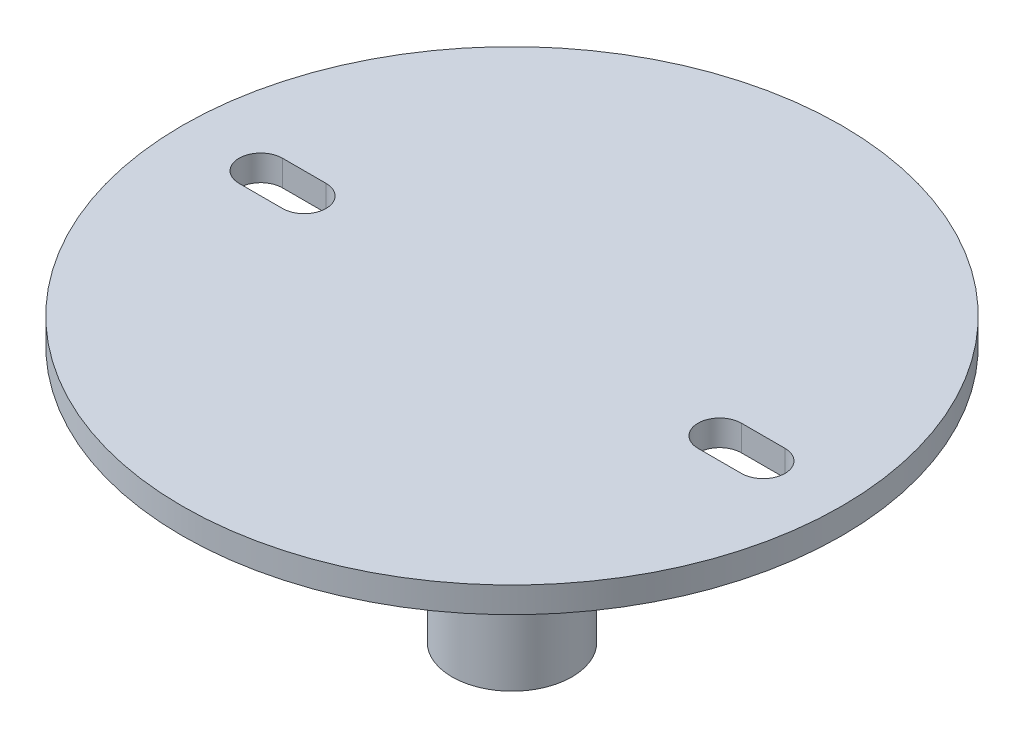
ISO-10303-21;
HEADER;
FILE_DESCRIPTION(('STEP AP214'),'2;1');
FILE_NAME('part.step','',(''),(''),'','','');
FILE_SCHEMA(('AUTOMOTIVE_DESIGN { 1 0 10303 214 1 1 1 1 }'));
ENDSEC;
DATA;
#1=APPLICATION_CONTEXT('core data for automotive mechanical design processes');
#2=APPLICATION_PROTOCOL_DEFINITION('international standard','automotive_design',2000,#1);
#3=PRODUCT_CONTEXT('',#1,'mechanical');
#4=PRODUCT('Part','Part','',(#3));
#5=PRODUCT_RELATED_PRODUCT_CATEGORY('part','',(#4));
#6=PRODUCT_DEFINITION_FORMATION('','',#4);
#7=PRODUCT_DEFINITION_CONTEXT('part definition',#1,'design');
#8=PRODUCT_DEFINITION('design','',#6,#7);
#9=PRODUCT_DEFINITION_SHAPE('','',#8);
#10=(LENGTH_UNIT() NAMED_UNIT(*) SI_UNIT(.MILLI.,.METRE.));
#11=(NAMED_UNIT(*) PLANE_ANGLE_UNIT() SI_UNIT($,.RADIAN.));
#12=(NAMED_UNIT(*) SI_UNIT($,.STERADIAN.) SOLID_ANGLE_UNIT());
#13=UNCERTAINTY_MEASURE_WITH_UNIT(LENGTH_MEASURE(1.E-05),#10,'distance_accuracy_value','');
#14=(GEOMETRIC_REPRESENTATION_CONTEXT(3) GLOBAL_UNCERTAINTY_ASSIGNED_CONTEXT((#13)) GLOBAL_UNIT_ASSIGNED_CONTEXT((#10,
#11,#12)) REPRESENTATION_CONTEXT('',''));
#15=CARTESIAN_POINT('',(0.,0.,0.));
#16=DIRECTION('',(0.,0.,1.));
#17=DIRECTION('',(1.,0.,0.));
#18=AXIS2_PLACEMENT_3D('',#15,#16,#17);
#19=CARTESIAN_POINT('',(0.,1.5,0.));
#20=DIRECTION('',(0.,1.,0.));
#21=DIRECTION('',(0.,0.,1.));
#22=AXIS2_PLACEMENT_3D('',#19,#20,#21);
#23=PLANE('',#22);
#24=CARTESIAN_POINT('',(0.,1.5,0.));
#25=DIRECTION('',(0.,1.,0.));
#26=DIRECTION('',(0.,0.,1.));
#27=AXIS2_PLACEMENT_3D('',#24,#25,#26);
#28=CIRCLE('',#27,19.24);
#29=CARTESIAN_POINT('',(0.,1.5,19.24));
#30=VERTEX_POINT('',#29);
#31=EDGE_CURVE('E166',#30,#30,#28,.T.);
#32=ORIENTED_EDGE('',*,*,#31,.T.);
#33=EDGE_LOOP('',(#32));
#34=FACE_BOUND('',#33,.T.);
#35=DIRECTION('',(-1.,0.,0.));
#36=VECTOR('',#35,1.);
#37=CARTESIAN_POINT('',(14.66,1.5,-1.27));
#38=LINE('',#37,#36);
#39=CARTESIAN_POINT('',(14.66,1.5,-1.27));
#40=VERTEX_POINT('',#39);
#41=CARTESIAN_POINT('',(12.12,1.5,-1.27));
#42=VERTEX_POINT('',#41);
#43=EDGE_CURVE('E137',#40,#42,#38,.T.);
#44=ORIENTED_EDGE('',*,*,#43,.F.);
#45=CARTESIAN_POINT('',(14.66,1.5,0.));
#46=DIRECTION('',(0.,1.,0.));
#47=DIRECTION('',(0.,0.,-1.));
#48=AXIS2_PLACEMENT_3D('',#45,#46,#47);
#49=CIRCLE('',#48,1.27);
#50=CARTESIAN_POINT('',(14.66,1.5,1.27));
#51=VERTEX_POINT('',#50);
#52=EDGE_CURVE('E135',#51,#40,#49,.T.);
#53=ORIENTED_EDGE('',*,*,#52,.F.);
#54=DIRECTION('',(1.,0.,0.));
#55=VECTOR('',#54,1.);
#56=CARTESIAN_POINT('',(14.66,1.5,1.27));
#57=LINE('',#56,#55);
#58=CARTESIAN_POINT('',(12.12,1.5,1.27));
#59=VERTEX_POINT('',#58);
#60=EDGE_CURVE('E143',#59,#51,#57,.T.);
#61=ORIENTED_EDGE('',*,*,#60,.F.);
#62=CARTESIAN_POINT('',(12.12,1.5,0.));
#63=DIRECTION('',(0.,1.,0.));
#64=DIRECTION('',(0.,0.,1.));
#65=AXIS2_PLACEMENT_3D('',#62,#63,#64);
#66=CIRCLE('',#65,1.27);
#67=EDGE_CURVE('E140',#42,#59,#66,.T.);
#68=ORIENTED_EDGE('',*,*,#67,.F.);
#69=EDGE_LOOP('',(#44,#53,#61,#68));
#70=FACE_BOUND('',#69,.T.);
#71=DIRECTION('',(1.,0.,0.));
#72=VECTOR('',#71,1.);
#73=CARTESIAN_POINT('',(-14.66,1.5,1.27));
#74=LINE('',#73,#72);
#75=CARTESIAN_POINT('',(-14.66,1.5,1.27));
#76=VERTEX_POINT('',#75);
#77=CARTESIAN_POINT('',(-12.12,1.5,1.27));
#78=VERTEX_POINT('',#77);
#79=EDGE_CURVE('E105',#76,#78,#74,.T.);
#80=ORIENTED_EDGE('',*,*,#79,.F.);
#81=CARTESIAN_POINT('',(-14.66,1.5,0.));
#82=DIRECTION('',(0.,1.,0.));
#83=DIRECTION('',(0.,0.,1.));
#84=AXIS2_PLACEMENT_3D('',#81,#82,#83);
#85=CIRCLE('',#84,1.27);
#86=CARTESIAN_POINT('',(-14.66,1.5,-1.27));
#87=VERTEX_POINT('',#86);
#88=EDGE_CURVE('E97',#87,#76,#85,.T.);
#89=ORIENTED_EDGE('',*,*,#88,.F.);
#90=DIRECTION('',(-1.,0.,0.));
#91=VECTOR('',#90,1.);
#92=CARTESIAN_POINT('',(-14.66,1.5,-1.27));
#93=LINE('',#92,#91);
#94=CARTESIAN_POINT('',(-12.12,1.5,-1.27));
#95=VERTEX_POINT('',#94);
#96=EDGE_CURVE('E119',#95,#87,#93,.T.);
#97=ORIENTED_EDGE('',*,*,#96,.F.);
#98=CARTESIAN_POINT('',(-12.12,1.5,0.));
#99=DIRECTION('',(0.,1.,0.));
#100=DIRECTION('',(0.,0.,-1.));
#101=AXIS2_PLACEMENT_3D('',#98,#99,#100);
#102=CIRCLE('',#101,1.27);
#103=EDGE_CURVE('E117',#78,#95,#102,.T.);
#104=ORIENTED_EDGE('',*,*,#103,.F.);
#105=EDGE_LOOP('',(#80,#89,#97,#104));
#106=FACE_BOUND('',#105,.T.);
#107=ADVANCED_FACE('F32',(#34,#70,#106),#23,.T.);
#108=CARTESIAN_POINT('',(0.,0.,0.));
#109=DIRECTION('',(0.,1.,0.));
#110=DIRECTION('',(0.,0.,1.));
#111=AXIS2_PLACEMENT_3D('',#108,#109,#110);
#112=PLANE('',#111);
#113=CARTESIAN_POINT('',(0.,0.,0.));
#114=DIRECTION('',(0.,1.,0.));
#115=DIRECTION('',(0.,0.,1.));
#116=AXIS2_PLACEMENT_3D('',#113,#114,#115);
#117=CIRCLE('',#116,4.5);
#118=CARTESIAN_POINT('',(0.,0.,4.5));
#119=VERTEX_POINT('',#118);
#120=EDGE_CURVE('E11',#119,#119,#117,.T.);
#121=ORIENTED_EDGE('',*,*,#120,.T.);
#122=EDGE_LOOP('',(#121));
#123=FACE_BOUND('',#122,.T.);
#124=CARTESIAN_POINT('',(14.66,0.,0.));
#125=DIRECTION('',(0.,1.,0.));
#126=DIRECTION('',(0.,0.,-1.));
#127=AXIS2_PLACEMENT_3D('',#124,#125,#126);
#128=CIRCLE('',#127,1.27);
#129=CARTESIAN_POINT('',(14.66,0.,1.27));
#130=VERTEX_POINT('',#129);
#131=CARTESIAN_POINT('',(14.66,0.,-1.27));
#132=VERTEX_POINT('',#131);
#133=EDGE_CURVE('E113',#130,#132,#128,.T.);
#134=ORIENTED_EDGE('',*,*,#133,.T.);
#135=DIRECTION('',(-1.,0.,0.));
#136=VECTOR('',#135,1.);
#137=CARTESIAN_POINT('',(14.66,0.,-1.27));
#138=LINE('',#137,#136);
#139=CARTESIAN_POINT('',(12.12,0.,-1.27));
#140=VERTEX_POINT('',#139);
#141=EDGE_CURVE('E148',#132,#140,#138,.T.);
#142=ORIENTED_EDGE('',*,*,#141,.T.);
#143=CARTESIAN_POINT('',(12.12,0.,0.));
#144=DIRECTION('',(0.,1.,0.));
#145=DIRECTION('',(0.,0.,1.));
#146=AXIS2_PLACEMENT_3D('',#143,#144,#145);
#147=CIRCLE('',#146,1.27);
#148=CARTESIAN_POINT('',(12.12,0.,1.27));
#149=VERTEX_POINT('',#148);
#150=EDGE_CURVE('E151',#140,#149,#147,.T.);
#151=ORIENTED_EDGE('',*,*,#150,.T.);
#152=DIRECTION('',(1.,0.,0.));
#153=VECTOR('',#152,1.);
#154=CARTESIAN_POINT('',(14.66,0.,1.27));
#155=LINE('',#154,#153);
#156=EDGE_CURVE('E138',#149,#130,#155,.T.);
#157=ORIENTED_EDGE('',*,*,#156,.T.);
#158=EDGE_LOOP('',(#134,#142,#151,#157));
#159=FACE_BOUND('',#158,.T.);
#160=CARTESIAN_POINT('',(0.,0.,0.));
#161=DIRECTION('',(0.,1.,0.));
#162=DIRECTION('',(0.,0.,1.));
#163=AXIS2_PLACEMENT_3D('',#160,#161,#162);
#164=CIRCLE('',#163,19.24);
#165=CARTESIAN_POINT('',(0.,0.,19.24));
#166=VERTEX_POINT('',#165);
#167=EDGE_CURVE('E165',#166,#166,#164,.T.);
#168=ORIENTED_EDGE('',*,*,#167,.F.);
#169=EDGE_LOOP('',(#168));
#170=FACE_BOUND('',#169,.T.);
#171=CARTESIAN_POINT('',(-14.66,0.,0.));
#172=DIRECTION('',(0.,1.,0.));
#173=DIRECTION('',(0.,0.,1.));
#174=AXIS2_PLACEMENT_3D('',#171,#172,#173);
#175=CIRCLE('',#174,1.27);
#176=CARTESIAN_POINT('',(-14.66,0.,-1.27));
#177=VERTEX_POINT('',#176);
#178=CARTESIAN_POINT('',(-14.66,0.,1.27));
#179=VERTEX_POINT('',#178);
#180=EDGE_CURVE('E55',#177,#179,#175,.T.);
#181=ORIENTED_EDGE('',*,*,#180,.T.);
#182=DIRECTION('',(1.,0.,0.));
#183=VECTOR('',#182,1.);
#184=CARTESIAN_POINT('',(-14.66,0.,1.27));
#185=LINE('',#184,#183);
#186=CARTESIAN_POINT('',(-12.12,0.,1.27));
#187=VERTEX_POINT('',#186);
#188=EDGE_CURVE('E112',#179,#187,#185,.T.);
#189=ORIENTED_EDGE('',*,*,#188,.T.);
#190=CARTESIAN_POINT('',(-12.12,0.,0.));
#191=DIRECTION('',(0.,1.,0.));
#192=DIRECTION('',(0.,0.,-1.));
#193=AXIS2_PLACEMENT_3D('',#190,#191,#192);
#194=CIRCLE('',#193,1.27);
#195=CARTESIAN_POINT('',(-12.12,0.,-1.27));
#196=VERTEX_POINT('',#195);
#197=EDGE_CURVE('E127',#187,#196,#194,.T.);
#198=ORIENTED_EDGE('',*,*,#197,.T.);
#199=DIRECTION('',(-1.,0.,0.));
#200=VECTOR('',#199,1.);
#201=CARTESIAN_POINT('',(-14.66,0.,-1.27));
#202=LINE('',#201,#200);
#203=EDGE_CURVE('E106',#196,#177,#202,.T.);
#204=ORIENTED_EDGE('',*,*,#203,.T.);
#205=EDGE_LOOP('',(#181,#189,#198,#204));
#206=FACE_BOUND('',#205,.T.);
#207=ADVANCED_FACE('F185',(#123,#159,#170,#206),#112,.F.);
#208=CARTESIAN_POINT('',(0.,1.5,0.));
#209=DIRECTION('',(0.,-1.,0.));
#210=DIRECTION('',(0.,0.,-1.));
#211=AXIS2_PLACEMENT_3D('',#208,#209,#210);
#212=CYLINDRICAL_SURFACE('',#211,19.24);
#213=ORIENTED_EDGE('',*,*,#31,.F.);
#214=EDGE_LOOP('',(#213));
#215=FACE_BOUND('',#214,.T.);
#216=ORIENTED_EDGE('',*,*,#167,.T.);
#217=EDGE_LOOP('',(#216));
#218=FACE_BOUND('',#217,.T.);
#219=ADVANCED_FACE('F193',(#215,#218),#212,.T.);
#220=CARTESIAN_POINT('',(14.66,1.5,0.));
#221=DIRECTION('',(0.,-1.,0.));
#222=DIRECTION('',(0.,0.,-1.));
#223=AXIS2_PLACEMENT_3D('',#220,#221,#222);
#224=CYLINDRICAL_SURFACE('',#223,1.27);
#225=ORIENTED_EDGE('',*,*,#133,.F.);
#226=DIRECTION('',(0.,-1.,0.));
#227=VECTOR('',#226,1.);
#228=CARTESIAN_POINT('',(14.66,1.5,1.27));
#229=LINE('',#228,#227);
#230=EDGE_CURVE('E145',#51,#130,#229,.T.);
#231=ORIENTED_EDGE('',*,*,#230,.F.);
#232=ORIENTED_EDGE('',*,*,#52,.T.);
#233=DIRECTION('',(0.,-1.,0.));
#234=VECTOR('',#233,1.);
#235=CARTESIAN_POINT('',(14.66,1.5,-1.27));
#236=LINE('',#235,#234);
#237=EDGE_CURVE('E162',#40,#132,#236,.T.);
#238=ORIENTED_EDGE('',*,*,#237,.T.);
#239=EDGE_LOOP('',(#225,#231,#232,#238));
#240=FACE_BOUND('',#239,.T.);
#241=ADVANCED_FACE('F197',(#240),#224,.F.);
#242=CARTESIAN_POINT('',(14.66,1.5,-1.27));
#243=DIRECTION('',(0.,0.,1.));
#244=DIRECTION('',(1.,0.,0.));
#245=AXIS2_PLACEMENT_3D('',#242,#243,#244);
#246=PLANE('',#245);
#247=ORIENTED_EDGE('',*,*,#141,.F.);
#248=ORIENTED_EDGE('',*,*,#237,.F.);
#249=ORIENTED_EDGE('',*,*,#43,.T.);
#250=DIRECTION('',(0.,-1.,0.));
#251=VECTOR('',#250,1.);
#252=CARTESIAN_POINT('',(12.12,1.5,-1.27));
#253=LINE('',#252,#251);
#254=EDGE_CURVE('E160',#42,#140,#253,.T.);
#255=ORIENTED_EDGE('',*,*,#254,.T.);
#256=EDGE_LOOP('',(#247,#248,#249,#255));
#257=FACE_BOUND('',#256,.T.);
#258=ADVANCED_FACE('F204',(#257),#246,.T.);
#259=CARTESIAN_POINT('',(12.12,1.5,0.));
#260=DIRECTION('',(0.,-1.,0.));
#261=DIRECTION('',(0.,0.,-1.));
#262=AXIS2_PLACEMENT_3D('',#259,#260,#261);
#263=CYLINDRICAL_SURFACE('',#262,1.27);
#264=ORIENTED_EDGE('',*,*,#150,.F.);
#265=ORIENTED_EDGE('',*,*,#254,.F.);
#266=ORIENTED_EDGE('',*,*,#67,.T.);
#267=DIRECTION('',(0.,-1.,0.));
#268=VECTOR('',#267,1.);
#269=CARTESIAN_POINT('',(12.12,1.5,1.27));
#270=LINE('',#269,#268);
#271=EDGE_CURVE('E158',#59,#149,#270,.T.);
#272=ORIENTED_EDGE('',*,*,#271,.T.);
#273=EDGE_LOOP('',(#264,#265,#266,#272));
#274=FACE_BOUND('',#273,.T.);
#275=ADVANCED_FACE('F234',(#274),#263,.F.);
#276=CARTESIAN_POINT('',(14.66,1.5,1.27));
#277=DIRECTION('',(0.,0.,-1.));
#278=DIRECTION('',(-1.,0.,0.));
#279=AXIS2_PLACEMENT_3D('',#276,#277,#278);
#280=PLANE('',#279);
#281=ORIENTED_EDGE('',*,*,#156,.F.);
#282=ORIENTED_EDGE('',*,*,#271,.F.);
#283=ORIENTED_EDGE('',*,*,#60,.T.);
#284=ORIENTED_EDGE('',*,*,#230,.T.);
#285=EDGE_LOOP('',(#281,#282,#283,#284));
#286=FACE_BOUND('',#285,.T.);
#287=ADVANCED_FACE('F231',(#286),#280,.T.);
#288=CARTESIAN_POINT('',(-14.66,1.5,0.));
#289=DIRECTION('',(0.,-1.,0.));
#290=DIRECTION('',(0.,0.,-1.));
#291=AXIS2_PLACEMENT_3D('',#288,#289,#290);
#292=CYLINDRICAL_SURFACE('',#291,1.27);
#293=ORIENTED_EDGE('',*,*,#180,.F.);
#294=DIRECTION('',(0.,-1.,0.));
#295=VECTOR('',#294,1.);
#296=CARTESIAN_POINT('',(-14.66,1.5,-1.27));
#297=LINE('',#296,#295);
#298=EDGE_CURVE('E101',#87,#177,#297,.T.);
#299=ORIENTED_EDGE('',*,*,#298,.F.);
#300=ORIENTED_EDGE('',*,*,#88,.T.);
#301=DIRECTION('',(0.,-1.,0.));
#302=VECTOR('',#301,1.);
#303=CARTESIAN_POINT('',(-14.66,1.5,1.27));
#304=LINE('',#303,#302);
#305=EDGE_CURVE('E100',#76,#179,#304,.T.);
#306=ORIENTED_EDGE('',*,*,#305,.T.);
#307=EDGE_LOOP('',(#293,#299,#300,#306));
#308=FACE_BOUND('',#307,.T.);
#309=ADVANCED_FACE('F99',(#308),#292,.F.);
#310=CARTESIAN_POINT('',(-14.66,1.5,1.27));
#311=DIRECTION('',(0.,0.,-1.));
#312=DIRECTION('',(-1.,0.,0.));
#313=AXIS2_PLACEMENT_3D('',#310,#311,#312);
#314=PLANE('',#313);
#315=ORIENTED_EDGE('',*,*,#188,.F.);
#316=ORIENTED_EDGE('',*,*,#305,.F.);
#317=ORIENTED_EDGE('',*,*,#79,.T.);
#318=DIRECTION('',(0.,-1.,0.));
#319=VECTOR('',#318,1.);
#320=CARTESIAN_POINT('',(-12.12,1.5,1.27));
#321=LINE('',#320,#319);
#322=EDGE_CURVE('E114',#78,#187,#321,.T.);
#323=ORIENTED_EDGE('',*,*,#322,.T.);
#324=EDGE_LOOP('',(#315,#316,#317,#323));
#325=FACE_BOUND('',#324,.T.);
#326=ADVANCED_FACE('F109',(#325),#314,.T.);
#327=CARTESIAN_POINT('',(-12.12,1.5,0.));
#328=DIRECTION('',(0.,-1.,0.));
#329=DIRECTION('',(0.,0.,-1.));
#330=AXIS2_PLACEMENT_3D('',#327,#328,#329);
#331=CYLINDRICAL_SURFACE('',#330,1.27);
#332=ORIENTED_EDGE('',*,*,#197,.F.);
#333=ORIENTED_EDGE('',*,*,#322,.F.);
#334=ORIENTED_EDGE('',*,*,#103,.T.);
#335=DIRECTION('',(0.,-1.,0.));
#336=VECTOR('',#335,1.);
#337=CARTESIAN_POINT('',(-12.12,1.5,-1.27));
#338=LINE('',#337,#336);
#339=EDGE_CURVE('E47',#95,#196,#338,.T.);
#340=ORIENTED_EDGE('',*,*,#339,.T.);
#341=EDGE_LOOP('',(#332,#333,#334,#340));
#342=FACE_BOUND('',#341,.T.);
#343=ADVANCED_FACE('F215',(#342),#331,.F.);
#344=CARTESIAN_POINT('',(-14.66,1.5,-1.27));
#345=DIRECTION('',(0.,0.,1.));
#346=DIRECTION('',(1.,0.,0.));
#347=AXIS2_PLACEMENT_3D('',#344,#345,#346);
#348=PLANE('',#347);
#349=ORIENTED_EDGE('',*,*,#203,.F.);
#350=ORIENTED_EDGE('',*,*,#339,.F.);
#351=ORIENTED_EDGE('',*,*,#96,.T.);
#352=ORIENTED_EDGE('',*,*,#298,.T.);
#353=EDGE_LOOP('',(#349,#350,#351,#352));
#354=FACE_BOUND('',#353,.T.);
#355=ADVANCED_FACE('F212',(#354),#348,.T.);
#356=CARTESIAN_POINT('',(0.,-15.,0.));
#357=DIRECTION('',(0.,-1.,0.));
#358=DIRECTION('',(0.,0.,-1.));
#359=AXIS2_PLACEMENT_3D('',#356,#357,#358);
#360=PLANE('',#359);
#361=CARTESIAN_POINT('',(0.,-15.,0.));
#362=DIRECTION('',(0.,-1.,0.));
#363=DIRECTION('',(0.,0.,-1.));
#364=AXIS2_PLACEMENT_3D('',#361,#362,#363);
#365=CIRCLE('',#364,3.5);
#366=CARTESIAN_POINT('',(0.,-15.,-3.5));
#367=VERTEX_POINT('',#366);
#368=EDGE_CURVE('E125',#367,#367,#365,.T.);
#369=ORIENTED_EDGE('',*,*,#368,.T.);
#370=EDGE_LOOP('',(#369));
#371=FACE_BOUND('',#370,.T.);
#372=CARTESIAN_POINT('',(0.,-15.,0.));
#373=DIRECTION('',(0.,-1.,0.));
#374=DIRECTION('',(0.,0.,-1.));
#375=AXIS2_PLACEMENT_3D('',#372,#373,#374);
#376=CIRCLE('',#375,2.);
#377=CARTESIAN_POINT('',(0.,-15.,-2.));
#378=VERTEX_POINT('',#377);
#379=EDGE_CURVE('E345',#378,#378,#376,.T.);
#380=ORIENTED_EDGE('',*,*,#379,.F.);
#381=EDGE_LOOP('',(#380));
#382=FACE_BOUND('',#381,.T.);
#383=ADVANCED_FACE('F214',(#371,#382),#360,.T.);
#384=CARTESIAN_POINT('',(0.,-15.,0.));
#385=DIRECTION('',(0.,1.,0.));
#386=DIRECTION('',(0.,0.,1.));
#387=AXIS2_PLACEMENT_3D('',#384,#385,#386);
#388=CYLINDRICAL_SURFACE('',#387,3.5);
#389=CARTESIAN_POINT('',(0.,-1.,0.));
#390=DIRECTION('',(0.,1.,0.));
#391=DIRECTION('',(0.,0.,1.));
#392=AXIS2_PLACEMENT_3D('',#389,#390,#391);
#393=CIRCLE('',#392,3.5);
#394=CARTESIAN_POINT('',(0.,-1.,3.5));
#395=VERTEX_POINT('',#394);
#396=EDGE_CURVE('E40',#395,#395,#393,.F.);
#397=ORIENTED_EDGE('',*,*,#396,.T.);
#398=EDGE_LOOP('',(#397));
#399=FACE_BOUND('',#398,.T.);
#400=ORIENTED_EDGE('',*,*,#368,.F.);
#401=EDGE_LOOP('',(#400));
#402=FACE_BOUND('',#401,.T.);
#403=ADVANCED_FACE('F173',(#399,#402),#388,.T.);
#404=CARTESIAN_POINT('',(0.,-15.,0.));
#405=DIRECTION('',(0.,1.,0.));
#406=DIRECTION('',(0.,0.,1.));
#407=AXIS2_PLACEMENT_3D('',#404,#405,#406);
#408=CYLINDRICAL_SURFACE('',#407,2.);
#409=ORIENTED_EDGE('',*,*,#379,.T.);
#410=EDGE_LOOP('',(#409));
#411=FACE_BOUND('',#410,.T.);
#412=CARTESIAN_POINT('',(0.,0.,0.));
#413=DIRECTION('',(0.,-1.,0.));
#414=DIRECTION('',(0.,0.,-1.));
#415=AXIS2_PLACEMENT_3D('',#412,#413,#414);
#416=CIRCLE('',#415,2.);
#417=CARTESIAN_POINT('',(0.,0.,-2.));
#418=VERTEX_POINT('',#417);
#419=EDGE_CURVE('E348',#418,#418,#416,.T.);
#420=ORIENTED_EDGE('',*,*,#419,.F.);
#421=EDGE_LOOP('',(#420));
#422=FACE_BOUND('',#421,.T.);
#423=ADVANCED_FACE('F182',(#411,#422),#408,.F.);
#424=ORIENTED_EDGE('',*,*,#419,.T.);
#425=EDGE_LOOP('',(#424));
#426=FACE_BOUND('',#425,.T.);
#427=ADVANCED_FACE('F177',(#426),#112,.F.);
#428=CARTESIAN_POINT('',(0.,-1.,0.));
#429=DIRECTION('',(0.,1.,0.));
#430=DIRECTION('',(0.,0.,1.));
#431=AXIS2_PLACEMENT_3D('',#428,#429,#430);
#432=TOROIDAL_SURFACE('',#431,4.5,1.);
#433=ORIENTED_EDGE('',*,*,#120,.F.);
#434=EDGE_LOOP('',(#433));
#435=FACE_BOUND('',#434,.T.);
#436=ORIENTED_EDGE('',*,*,#396,.F.);
#437=EDGE_LOOP('',(#436));
#438=FACE_BOUND('',#437,.T.);
#439=ADVANCED_FACE('F34',(#435,#438),#432,.F.);
#440=CLOSED_SHELL('',(#107,#207,#219,#241,#258,#275,#287,#309,#326,#343,#355,#383,#403,#423,
#427,#439));
#441=MANIFOLD_SOLID_BREP('B2',#440);
#442=ADVANCED_BREP_SHAPE_REPRESENTATION('',(#18,#441),#14);
#443=SHAPE_DEFINITION_REPRESENTATION(#9,#442);
ENDSEC;
END-ISO-10303-21;
